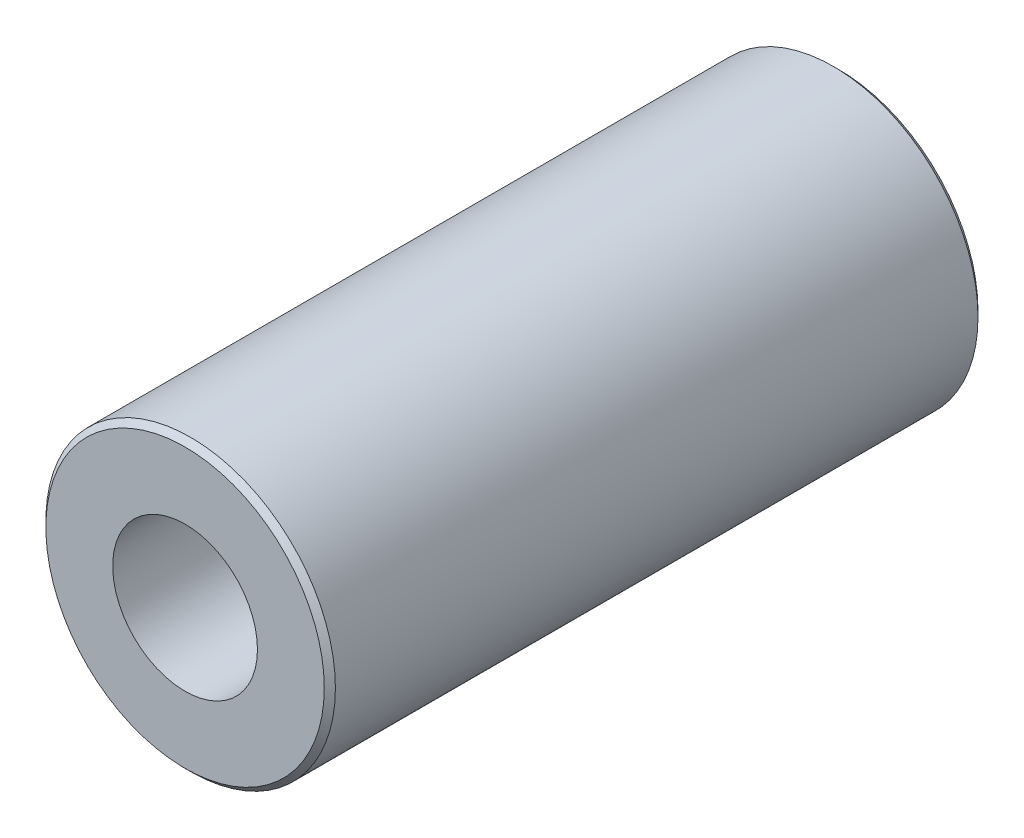
ISO-10303-21;
HEADER;
FILE_DESCRIPTION(('STEP AP214'),'2;1');
FILE_NAME('part.step','',(''),(''),'','','');
FILE_SCHEMA(('AUTOMOTIVE_DESIGN { 1 0 10303 214 1 1 1 1 }'));
ENDSEC;
DATA;
#1=APPLICATION_CONTEXT('core data for automotive mechanical design processes');
#2=APPLICATION_PROTOCOL_DEFINITION('international standard','automotive_design',2000,#1);
#3=PRODUCT_CONTEXT('',#1,'mechanical');
#4=PRODUCT('Part','Part','',(#3));
#5=PRODUCT_RELATED_PRODUCT_CATEGORY('part','',(#4));
#6=PRODUCT_DEFINITION_FORMATION('','',#4);
#7=PRODUCT_DEFINITION_CONTEXT('part definition',#1,'design');
#8=PRODUCT_DEFINITION('design','',#6,#7);
#9=PRODUCT_DEFINITION_SHAPE('','',#8);
#10=(LENGTH_UNIT() NAMED_UNIT(*) SI_UNIT(.MILLI.,.METRE.));
#11=(NAMED_UNIT(*) PLANE_ANGLE_UNIT() SI_UNIT($,.RADIAN.));
#12=(NAMED_UNIT(*) SI_UNIT($,.STERADIAN.) SOLID_ANGLE_UNIT());
#13=UNCERTAINTY_MEASURE_WITH_UNIT(LENGTH_MEASURE(1.E-05),#10,'distance_accuracy_value','');
#14=(GEOMETRIC_REPRESENTATION_CONTEXT(3) GLOBAL_UNCERTAINTY_ASSIGNED_CONTEXT((#13)) GLOBAL_UNIT_ASSIGNED_CONTEXT((#10,
#11,#12)) REPRESENTATION_CONTEXT('',''));
#15=CARTESIAN_POINT('',(0.,0.,0.));
#16=DIRECTION('',(0.,0.,1.));
#17=DIRECTION('',(1.,0.,0.));
#18=AXIS2_PLACEMENT_3D('',#15,#16,#17);
#19=CARTESIAN_POINT('',(0.,0.,58.7));
#20=DIRECTION('',(0.,0.,1.));
#21=DIRECTION('',(1.,0.,0.));
#22=AXIS2_PLACEMENT_3D('',#19,#20,#21);
#23=PLANE('',#22);
#24=CARTESIAN_POINT('',(0.,0.,58.7));
#25=DIRECTION('',(0.,0.,1.));
#26=DIRECTION('',(1.,0.,0.));
#27=AXIS2_PLACEMENT_3D('',#24,#25,#26);
#28=CIRCLE('',#27,12.5);
#29=CARTESIAN_POINT('',(12.5,0.,58.7));
#30=VERTEX_POINT('',#29);
#31=EDGE_CURVE('E11',#30,#30,#28,.T.);
#32=ORIENTED_EDGE('',*,*,#31,.T.);
#33=EDGE_LOOP('',(#32));
#34=FACE_BOUND('',#33,.T.);
#35=CARTESIAN_POINT('',(0.,0.,58.7));
#36=DIRECTION('',(0.,0.,1.));
#37=DIRECTION('',(1.,0.,0.));
#38=AXIS2_PLACEMENT_3D('',#35,#36,#37);
#39=CIRCLE('',#38,6.5);
#40=CARTESIAN_POINT('',(6.5,0.,58.7));
#41=VERTEX_POINT('',#40);
#42=EDGE_CURVE('E74',#41,#41,#39,.T.);
#43=ORIENTED_EDGE('',*,*,#42,.F.);
#44=EDGE_LOOP('',(#43));
#45=FACE_BOUND('',#44,.T.);
#46=ADVANCED_FACE('F49',(#34,#45),#23,.T.);
#47=CARTESIAN_POINT('',(0.,0.,0.));
#48=DIRECTION('',(0.,0.,1.));
#49=DIRECTION('',(1.,0.,0.));
#50=AXIS2_PLACEMENT_3D('',#47,#48,#49);
#51=PLANE('',#50);
#52=CARTESIAN_POINT('',(0.,0.,0.));
#53=DIRECTION('',(0.,0.,1.));
#54=DIRECTION('',(1.,0.,0.));
#55=AXIS2_PLACEMENT_3D('',#52,#53,#54);
#56=CIRCLE('',#55,12.5);
#57=CARTESIAN_POINT('',(12.5,0.,0.));
#58=VERTEX_POINT('',#57);
#59=EDGE_CURVE('E58',#58,#58,#56,.F.);
#60=ORIENTED_EDGE('',*,*,#59,.T.);
#61=EDGE_LOOP('',(#60));
#62=FACE_BOUND('',#61,.T.);
#63=CARTESIAN_POINT('',(0.,0.,0.));
#64=DIRECTION('',(0.,0.,1.));
#65=DIRECTION('',(1.,0.,0.));
#66=AXIS2_PLACEMENT_3D('',#63,#64,#65);
#67=CIRCLE('',#66,6.5);
#68=CARTESIAN_POINT('',(6.5,0.,0.));
#69=VERTEX_POINT('',#68);
#70=EDGE_CURVE('E75',#69,#69,#67,.T.);
#71=ORIENTED_EDGE('',*,*,#70,.T.);
#72=EDGE_LOOP('',(#71));
#73=FACE_BOUND('',#72,.T.);
#74=ADVANCED_FACE('F87',(#62,#73),#51,.F.);
#75=CARTESIAN_POINT('',(0.,0.,58.7));
#76=DIRECTION('',(0.,0.,-1.));
#77=DIRECTION('',(-1.,0.,0.));
#78=AXIS2_PLACEMENT_3D('',#75,#76,#77);
#79=CYLINDRICAL_SURFACE('',#78,13.);
#80=CARTESIAN_POINT('',(0.,0.,0.5));
#81=DIRECTION('',(0.,0.,1.));
#82=DIRECTION('',(1.,0.,0.));
#83=AXIS2_PLACEMENT_3D('',#80,#81,#82);
#84=CIRCLE('',#83,13.);
#85=CARTESIAN_POINT('',(13.,0.,0.5));
#86=VERTEX_POINT('',#85);
#87=EDGE_CURVE('E63',#86,#86,#84,.T.);
#88=ORIENTED_EDGE('',*,*,#87,.T.);
#89=EDGE_LOOP('',(#88));
#90=FACE_BOUND('',#89,.T.);
#91=CARTESIAN_POINT('',(0.,0.,58.2));
#92=DIRECTION('',(0.,0.,1.));
#93=DIRECTION('',(1.,0.,0.));
#94=AXIS2_PLACEMENT_3D('',#91,#92,#93);
#95=CIRCLE('',#94,13.);
#96=CARTESIAN_POINT('',(13.,0.,58.2));
#97=VERTEX_POINT('',#96);
#98=EDGE_CURVE('E68',#97,#97,#95,.F.);
#99=ORIENTED_EDGE('',*,*,#98,.T.);
#100=EDGE_LOOP('',(#99));
#101=FACE_BOUND('',#100,.T.);
#102=ADVANCED_FACE('F92',(#90,#101),#79,.T.);
#103=CARTESIAN_POINT('',(0.,0.,58.7));
#104=DIRECTION('',(0.,0.,-1.));
#105=DIRECTION('',(-1.,0.,0.));
#106=AXIS2_PLACEMENT_3D('',#103,#104,#105);
#107=CYLINDRICAL_SURFACE('',#106,6.5);
#108=ORIENTED_EDGE('',*,*,#42,.T.);
#109=EDGE_LOOP('',(#108));
#110=FACE_BOUND('',#109,.T.);
#111=ORIENTED_EDGE('',*,*,#70,.F.);
#112=EDGE_LOOP('',(#111));
#113=FACE_BOUND('',#112,.T.);
#114=ADVANCED_FACE('F83',(#110,#113),#107,.F.);
#115=CARTESIAN_POINT('',(0.,0.,0.5));
#116=DIRECTION('',(0.,0.,1.));
#117=DIRECTION('',(1.,0.,0.));
#118=AXIS2_PLACEMENT_3D('',#115,#116,#117);
#119=CONICAL_SURFACE('',#118,13.,0.785398163397452);
#120=ORIENTED_EDGE('',*,*,#59,.F.);
#121=EDGE_LOOP('',(#120));
#122=FACE_BOUND('',#121,.T.);
#123=ORIENTED_EDGE('',*,*,#87,.F.);
#124=EDGE_LOOP('',(#123));
#125=FACE_BOUND('',#124,.T.);
#126=ADVANCED_FACE('F99',(#122,#125),#119,.T.);
#127=CARTESIAN_POINT('',(0.,0.,58.7));
#128=DIRECTION('',(0.,0.,-1.));
#129=DIRECTION('',(-1.,0.,0.));
#130=AXIS2_PLACEMENT_3D('',#127,#128,#129);
#131=CONICAL_SURFACE('',#130,12.5,0.785398163397438);
#132=ORIENTED_EDGE('',*,*,#98,.F.);
#133=EDGE_LOOP('',(#132));
#134=FACE_BOUND('',#133,.T.);
#135=ORIENTED_EDGE('',*,*,#31,.F.);
#136=EDGE_LOOP('',(#135));
#137=FACE_BOUND('',#136,.T.);
#138=ADVANCED_FACE('F52',(#134,#137),#131,.T.);
#139=CLOSED_SHELL('',(#46,#74,#102,#114,#126,#138));
#140=MANIFOLD_SOLID_BREP('B2',#139);
#141=ADVANCED_BREP_SHAPE_REPRESENTATION('',(#18,#140),#14);
#142=SHAPE_DEFINITION_REPRESENTATION(#9,#141);
ENDSEC;
END-ISO-10303-21;
